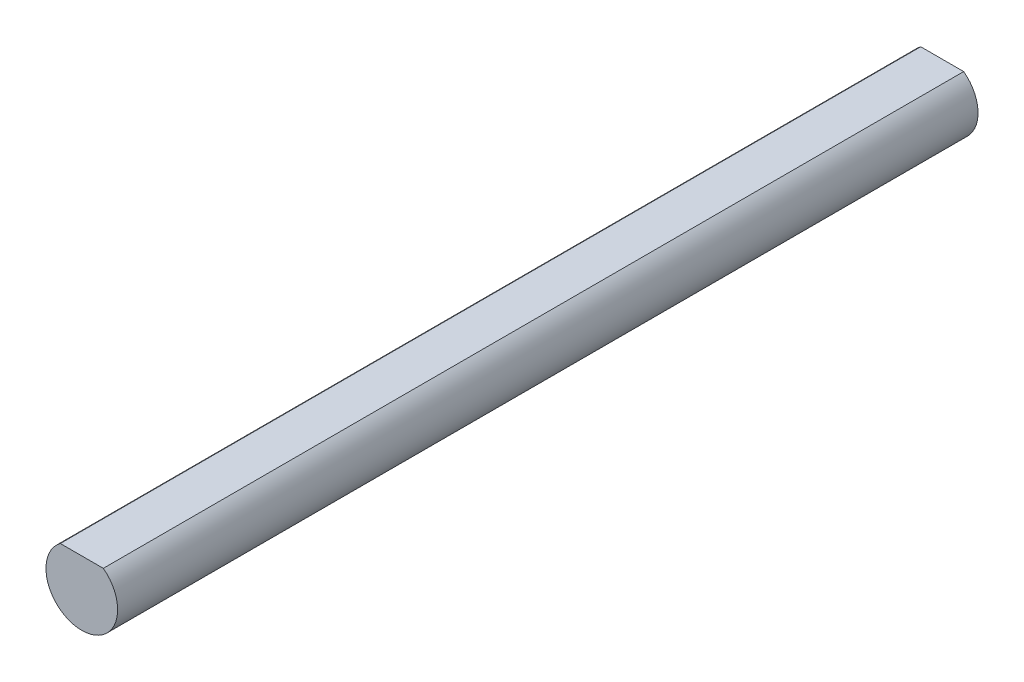
ISO-10303-21;
HEADER;
FILE_DESCRIPTION(('STEP AP214'),'2;1');
FILE_NAME('part.step','',(''),(''),'','','');
FILE_SCHEMA(('AUTOMOTIVE_DESIGN { 1 0 10303 214 1 1 1 1 }'));
ENDSEC;
DATA;
#1=APPLICATION_CONTEXT('core data for automotive mechanical design processes');
#2=APPLICATION_PROTOCOL_DEFINITION('international standard','automotive_design',2000,#1);
#3=PRODUCT_CONTEXT('',#1,'mechanical');
#4=PRODUCT('Part','Part','',(#3));
#5=PRODUCT_RELATED_PRODUCT_CATEGORY('part','',(#4));
#6=PRODUCT_DEFINITION_FORMATION('','',#4);
#7=PRODUCT_DEFINITION_CONTEXT('part definition',#1,'design');
#8=PRODUCT_DEFINITION('design','',#6,#7);
#9=PRODUCT_DEFINITION_SHAPE('','',#8);
#10=(LENGTH_UNIT() NAMED_UNIT(*) SI_UNIT(.MILLI.,.METRE.));
#11=(NAMED_UNIT(*) PLANE_ANGLE_UNIT() SI_UNIT($,.RADIAN.));
#12=(NAMED_UNIT(*) SI_UNIT($,.STERADIAN.) SOLID_ANGLE_UNIT());
#13=UNCERTAINTY_MEASURE_WITH_UNIT(LENGTH_MEASURE(1.E-05),#10,'distance_accuracy_value','');
#14=(GEOMETRIC_REPRESENTATION_CONTEXT(3) GLOBAL_UNCERTAINTY_ASSIGNED_CONTEXT((#13)) GLOBAL_UNIT_ASSIGNED_CONTEXT((#10,
#11,#12)) REPRESENTATION_CONTEXT('',''));
#15=CARTESIAN_POINT('',(0.,0.,0.));
#16=DIRECTION('',(0.,0.,1.));
#17=DIRECTION('',(1.,0.,0.));
#18=AXIS2_PLACEMENT_3D('',#15,#16,#17);
#19=CARTESIAN_POINT('',(0.,0.,76.2));
#20=DIRECTION('',(0.,0.,-1.));
#21=DIRECTION('',(-1.,0.,0.));
#22=AXIS2_PLACEMENT_3D('',#19,#20,#21);
#23=CYLINDRICAL_SURFACE('',#22,3.175);
#24=CARTESIAN_POINT('',(0.,0.,0.));
#25=DIRECTION('',(0.,0.,1.));
#26=DIRECTION('',(1.,0.,0.));
#27=AXIS2_PLACEMENT_3D('',#24,#25,#26);
#28=CIRCLE('',#27,3.175);
#29=CARTESIAN_POINT('',(-1.905,2.54,0.));
#30=VERTEX_POINT('',#29);
#31=CARTESIAN_POINT('',(1.905,2.54,0.));
#32=VERTEX_POINT('',#31);
#33=EDGE_CURVE('E64',#30,#32,#28,.T.);
#34=ORIENTED_EDGE('',*,*,#33,.T.);
#35=DIRECTION('',(0.,0.,-1.));
#36=VECTOR('',#35,1.);
#37=CARTESIAN_POINT('',(1.905,2.54,76.2));
#38=LINE('',#37,#36);
#39=CARTESIAN_POINT('',(1.905,2.54,76.2));
#40=VERTEX_POINT('',#39);
#41=EDGE_CURVE('E11',#40,#32,#38,.T.);
#42=ORIENTED_EDGE('',*,*,#41,.F.);
#43=CARTESIAN_POINT('',(0.,0.,76.2));
#44=DIRECTION('',(0.,0.,1.));
#45=DIRECTION('',(1.,0.,0.));
#46=AXIS2_PLACEMENT_3D('',#43,#44,#45);
#47=CIRCLE('',#46,3.175);
#48=CARTESIAN_POINT('',(-1.905,2.54,76.2));
#49=VERTEX_POINT('',#48);
#50=EDGE_CURVE('E66',#49,#40,#47,.T.);
#51=ORIENTED_EDGE('',*,*,#50,.F.);
#52=DIRECTION('',(0.,0.,-1.));
#53=VECTOR('',#52,1.);
#54=CARTESIAN_POINT('',(-1.905,2.54,76.2));
#55=LINE('',#54,#53);
#56=EDGE_CURVE('E48',#49,#30,#55,.T.);
#57=ORIENTED_EDGE('',*,*,#56,.T.);
#58=EDGE_LOOP('',(#34,#42,#51,#57));
#59=FACE_BOUND('',#58,.T.);
#60=ADVANCED_FACE('F39',(#59),#23,.T.);
#61=CARTESIAN_POINT('',(-1.905,2.54,76.2));
#62=DIRECTION('',(0.,1.,0.));
#63=DIRECTION('',(0.,0.,1.));
#64=AXIS2_PLACEMENT_3D('',#61,#62,#63);
#65=PLANE('',#64);
#66=DIRECTION('',(1.,0.,0.));
#67=VECTOR('',#66,1.);
#68=CARTESIAN_POINT('',(-1.905,2.54,0.));
#69=LINE('',#68,#67);
#70=EDGE_CURVE('E72',#30,#32,#69,.T.);
#71=ORIENTED_EDGE('',*,*,#70,.F.);
#72=ORIENTED_EDGE('',*,*,#56,.F.);
#73=DIRECTION('',(1.,0.,0.));
#74=VECTOR('',#73,1.);
#75=CARTESIAN_POINT('',(-1.905,2.54,76.2));
#76=LINE('',#75,#74);
#77=EDGE_CURVE('E69',#49,#40,#76,.T.);
#78=ORIENTED_EDGE('',*,*,#77,.T.);
#79=ORIENTED_EDGE('',*,*,#41,.T.);
#80=EDGE_LOOP('',(#71,#72,#78,#79));
#81=FACE_BOUND('',#80,.T.);
#82=ADVANCED_FACE('F75',(#81),#65,.T.);
#83=CARTESIAN_POINT('',(0.,0.,76.2));
#84=DIRECTION('',(0.,0.,1.));
#85=DIRECTION('',(1.,0.,0.));
#86=AXIS2_PLACEMENT_3D('',#83,#84,#85);
#87=PLANE('',#86);
#88=ORIENTED_EDGE('',*,*,#50,.T.);
#89=ORIENTED_EDGE('',*,*,#77,.F.);
#90=EDGE_LOOP('',(#88,#89));
#91=FACE_BOUND('',#90,.T.);
#92=ADVANCED_FACE('F83',(#91),#87,.T.);
#93=CARTESIAN_POINT('',(0.,0.,0.));
#94=DIRECTION('',(0.,0.,1.));
#95=DIRECTION('',(1.,0.,0.));
#96=AXIS2_PLACEMENT_3D('',#93,#94,#95);
#97=PLANE('',#96);
#98=ORIENTED_EDGE('',*,*,#33,.F.);
#99=ORIENTED_EDGE('',*,*,#70,.T.);
#100=EDGE_LOOP('',(#98,#99));
#101=FACE_BOUND('',#100,.T.);
#102=ADVANCED_FACE('F71',(#101),#97,.F.);
#103=CLOSED_SHELL('',(#60,#82,#92,#102));
#104=MANIFOLD_SOLID_BREP('B2',#103);
#105=ADVANCED_BREP_SHAPE_REPRESENTATION('',(#18,#104),#14);
#106=SHAPE_DEFINITION_REPRESENTATION(#9,#105);
ENDSEC;
END-ISO-10303-21;
